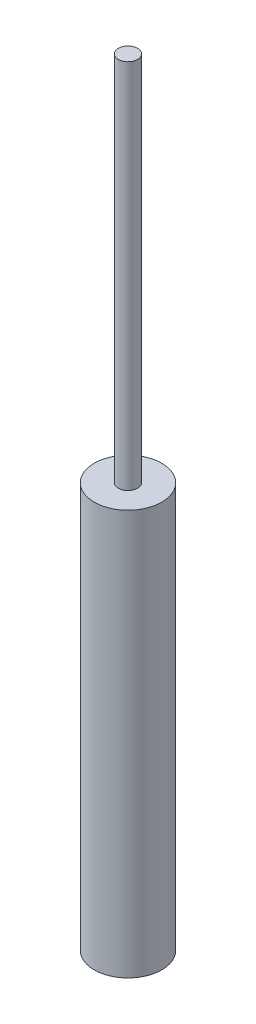
ISO-10303-21;
HEADER;
FILE_DESCRIPTION(('STEP AP214'),'2;1');
FILE_NAME('part.step','',(''),(''),'','','');
FILE_SCHEMA(('AUTOMOTIVE_DESIGN { 1 0 10303 214 1 1 1 1 }'));
ENDSEC;
DATA;
#1=APPLICATION_CONTEXT('core data for automotive mechanical design processes');
#2=APPLICATION_PROTOCOL_DEFINITION('international standard','automotive_design',2000,#1);
#3=PRODUCT_CONTEXT('',#1,'mechanical');
#4=PRODUCT('Part','Part','',(#3));
#5=PRODUCT_RELATED_PRODUCT_CATEGORY('part','',(#4));
#6=PRODUCT_DEFINITION_FORMATION('','',#4);
#7=PRODUCT_DEFINITION_CONTEXT('part definition',#1,'design');
#8=PRODUCT_DEFINITION('design','',#6,#7);
#9=PRODUCT_DEFINITION_SHAPE('','',#8);
#10=(LENGTH_UNIT() NAMED_UNIT(*) SI_UNIT(.MILLI.,.METRE.));
#11=(NAMED_UNIT(*) PLANE_ANGLE_UNIT() SI_UNIT($,.RADIAN.));
#12=(NAMED_UNIT(*) SI_UNIT($,.STERADIAN.) SOLID_ANGLE_UNIT());
#13=UNCERTAINTY_MEASURE_WITH_UNIT(LENGTH_MEASURE(1.E-05),#10,'distance_accuracy_value','');
#14=(GEOMETRIC_REPRESENTATION_CONTEXT(3) GLOBAL_UNCERTAINTY_ASSIGNED_CONTEXT((#13)) GLOBAL_UNIT_ASSIGNED_CONTEXT((#10,
#11,#12)) REPRESENTATION_CONTEXT('',''));
#15=CARTESIAN_POINT('',(0.,0.,0.));
#16=DIRECTION('',(0.,0.,1.));
#17=DIRECTION('',(1.,0.,0.));
#18=AXIS2_PLACEMENT_3D('',#15,#16,#17);
#19=CARTESIAN_POINT('',(0.,15.,0.));
#20=DIRECTION('',(0.,-1.,0.));
#21=DIRECTION('',(0.,0.,-1.));
#22=AXIS2_PLACEMENT_3D('',#19,#20,#21);
#23=CYLINDRICAL_SURFACE('',#22,2.5);
#24=CARTESIAN_POINT('',(0.,15.,0.));
#25=DIRECTION('',(0.,1.,0.));
#26=DIRECTION('',(0.,0.,1.));
#27=AXIS2_PLACEMENT_3D('',#24,#25,#26);
#28=CIRCLE('',#27,2.5);
#29=CARTESIAN_POINT('',(0.,15.,2.5));
#30=VERTEX_POINT('',#29);
#31=EDGE_CURVE('E41',#30,#30,#28,.T.);
#32=ORIENTED_EDGE('',*,*,#31,.F.);
#33=EDGE_LOOP('',(#32));
#34=FACE_BOUND('',#33,.T.);
#35=CARTESIAN_POINT('',(0.,-15.,0.));
#36=DIRECTION('',(0.,1.,0.));
#37=DIRECTION('',(0.,0.,1.));
#38=AXIS2_PLACEMENT_3D('',#35,#36,#37);
#39=CIRCLE('',#38,2.5);
#40=CARTESIAN_POINT('',(0.,-15.,2.5));
#41=VERTEX_POINT('',#40);
#42=EDGE_CURVE('E37',#41,#41,#39,.T.);
#43=ORIENTED_EDGE('',*,*,#42,.T.);
#44=EDGE_LOOP('',(#43));
#45=FACE_BOUND('',#44,.T.);
#46=ADVANCED_FACE('F34',(#34,#45),#23,.T.);
#47=CARTESIAN_POINT('',(0.,15.,0.));
#48=DIRECTION('',(0.,1.,0.));
#49=DIRECTION('',(0.,0.,1.));
#50=AXIS2_PLACEMENT_3D('',#47,#48,#49);
#51=PLANE('',#50);
#52=CARTESIAN_POINT('',(0.,15.,0.));
#53=DIRECTION('',(0.,1.,0.));
#54=DIRECTION('',(0.,0.,1.));
#55=AXIS2_PLACEMENT_3D('',#52,#53,#54);
#56=CIRCLE('',#55,0.715);
#57=CARTESIAN_POINT('',(0.,15.,0.715));
#58=VERTEX_POINT('',#57);
#59=EDGE_CURVE('E10',#58,#58,#56,.T.);
#60=ORIENTED_EDGE('',*,*,#59,.F.);
#61=EDGE_LOOP('',(#60));
#62=FACE_BOUND('',#61,.T.);
#63=ORIENTED_EDGE('',*,*,#31,.T.);
#64=EDGE_LOOP('',(#63));
#65=FACE_BOUND('',#64,.T.);
#66=ADVANCED_FACE('F58',(#62,#65),#51,.T.);
#67=CARTESIAN_POINT('',(0.,-15.,0.));
#68=DIRECTION('',(0.,1.,0.));
#69=DIRECTION('',(0.,0.,1.));
#70=AXIS2_PLACEMENT_3D('',#67,#68,#69);
#71=PLANE('',#70);
#72=ORIENTED_EDGE('',*,*,#42,.F.);
#73=EDGE_LOOP('',(#72));
#74=FACE_BOUND('',#73,.T.);
#75=ADVANCED_FACE('F55',(#74),#71,.F.);
#76=CARTESIAN_POINT('',(0.,42.5,0.));
#77=DIRECTION('',(0.,-1.,0.));
#78=DIRECTION('',(0.,0.,-1.));
#79=AXIS2_PLACEMENT_3D('',#76,#77,#78);
#80=CYLINDRICAL_SURFACE('',#79,0.715);
#81=CARTESIAN_POINT('',(0.,42.5,0.));
#82=DIRECTION('',(0.,1.,0.));
#83=DIRECTION('',(0.,0.,1.));
#84=AXIS2_PLACEMENT_3D('',#81,#82,#83);
#85=CIRCLE('',#84,0.715);
#86=CARTESIAN_POINT('',(0.,42.5,0.715));
#87=VERTEX_POINT('',#86);
#88=EDGE_CURVE('E47',#87,#87,#85,.T.);
#89=ORIENTED_EDGE('',*,*,#88,.F.);
#90=EDGE_LOOP('',(#89));
#91=FACE_BOUND('',#90,.T.);
#92=ORIENTED_EDGE('',*,*,#59,.T.);
#93=EDGE_LOOP('',(#92));
#94=FACE_BOUND('',#93,.T.);
#95=ADVANCED_FACE('F57',(#91,#94),#80,.T.);
#96=CARTESIAN_POINT('',(0.,42.5,0.));
#97=DIRECTION('',(0.,1.,0.));
#98=DIRECTION('',(0.,0.,1.));
#99=AXIS2_PLACEMENT_3D('',#96,#97,#98);
#100=PLANE('',#99);
#101=ORIENTED_EDGE('',*,*,#88,.T.);
#102=EDGE_LOOP('',(#101));
#103=FACE_BOUND('',#102,.T.);
#104=ADVANCED_FACE('F63',(#103),#100,.T.);
#105=CLOSED_SHELL('',(#46,#66,#75,#95,#104));
#106=MANIFOLD_SOLID_BREP('B2',#105);
#107=ADVANCED_BREP_SHAPE_REPRESENTATION('',(#18,#106),#14);
#108=SHAPE_DEFINITION_REPRESENTATION(#9,#107);
ENDSEC;
END-ISO-10303-21;
